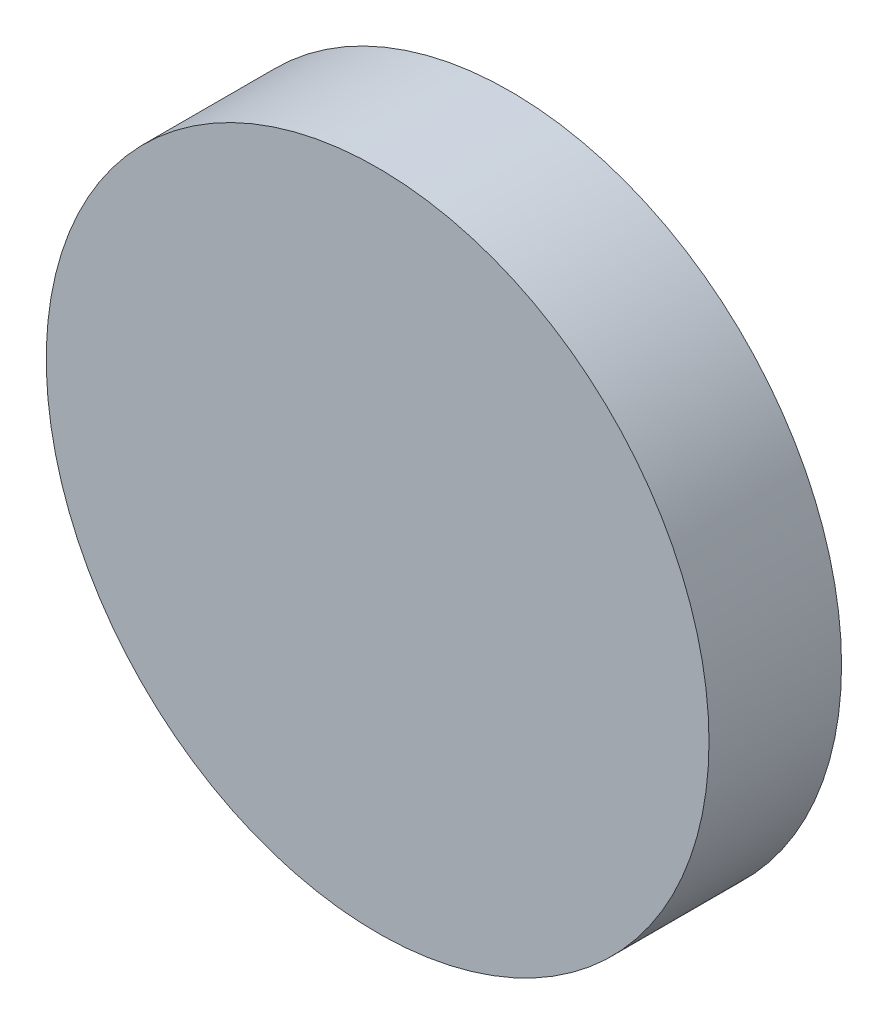
ISO-10303-21;
HEADER;
FILE_DESCRIPTION(('STEP AP214'),'2;1');
FILE_NAME('part.step','',(''),(''),'','','');
FILE_SCHEMA(('AUTOMOTIVE_DESIGN { 1 0 10303 214 1 1 1 1 }'));
ENDSEC;
DATA;
#1=APPLICATION_CONTEXT('core data for automotive mechanical design processes');
#2=APPLICATION_PROTOCOL_DEFINITION('international standard','automotive_design',2000,#1);
#3=PRODUCT_CONTEXT('',#1,'mechanical');
#4=PRODUCT('Part','Part','',(#3));
#5=PRODUCT_RELATED_PRODUCT_CATEGORY('part','',(#4));
#6=PRODUCT_DEFINITION_FORMATION('','',#4);
#7=PRODUCT_DEFINITION_CONTEXT('part definition',#1,'design');
#8=PRODUCT_DEFINITION('design','',#6,#7);
#9=PRODUCT_DEFINITION_SHAPE('','',#8);
#10=(LENGTH_UNIT() NAMED_UNIT(*) SI_UNIT(.MILLI.,.METRE.));
#11=(NAMED_UNIT(*) PLANE_ANGLE_UNIT() SI_UNIT($,.RADIAN.));
#12=(NAMED_UNIT(*) SI_UNIT($,.STERADIAN.) SOLID_ANGLE_UNIT());
#13=UNCERTAINTY_MEASURE_WITH_UNIT(LENGTH_MEASURE(1.E-05),#10,'distance_accuracy_value','');
#14=(GEOMETRIC_REPRESENTATION_CONTEXT(3) GLOBAL_UNCERTAINTY_ASSIGNED_CONTEXT((#13)) GLOBAL_UNIT_ASSIGNED_CONTEXT((#10,
#11,#12)) REPRESENTATION_CONTEXT('',''));
#15=CARTESIAN_POINT('',(0.,0.,0.));
#16=DIRECTION('',(0.,0.,1.));
#17=DIRECTION('',(1.,0.,0.));
#18=AXIS2_PLACEMENT_3D('',#15,#16,#17);
#19=CARTESIAN_POINT('',(0.,0.,5.08));
#20=DIRECTION('',(0.,0.,-1.));
#21=DIRECTION('',(-1.,0.,0.));
#22=AXIS2_PLACEMENT_3D('',#19,#20,#21);
#23=CYLINDRICAL_SURFACE('',#22,12.7);
#24=CARTESIAN_POINT('',(0.,0.,5.08));
#25=DIRECTION('',(0.,0.,1.));
#26=DIRECTION('',(1.,0.,0.));
#27=AXIS2_PLACEMENT_3D('',#24,#25,#26);
#28=CIRCLE('',#27,12.7);
#29=CARTESIAN_POINT('',(12.7,0.,5.08));
#30=VERTEX_POINT('',#29);
#31=EDGE_CURVE('E10',#30,#30,#28,.T.);
#32=ORIENTED_EDGE('',*,*,#31,.F.);
#33=EDGE_LOOP('',(#32));
#34=FACE_BOUND('',#33,.T.);
#35=CARTESIAN_POINT('',(0.,0.,0.));
#36=DIRECTION('',(0.,0.,1.));
#37=DIRECTION('',(1.,0.,0.));
#38=AXIS2_PLACEMENT_3D('',#35,#36,#37);
#39=CIRCLE('',#38,12.7);
#40=CARTESIAN_POINT('',(12.7,0.,0.));
#41=VERTEX_POINT('',#40);
#42=EDGE_CURVE('E40',#41,#41,#39,.T.);
#43=ORIENTED_EDGE('',*,*,#42,.T.);
#44=EDGE_LOOP('',(#43));
#45=FACE_BOUND('',#44,.T.);
#46=ADVANCED_FACE('F37',(#34,#45),#23,.T.);
#47=CARTESIAN_POINT('',(0.,0.,5.08));
#48=DIRECTION('',(0.,0.,1.));
#49=DIRECTION('',(1.,0.,0.));
#50=AXIS2_PLACEMENT_3D('',#47,#48,#49);
#51=PLANE('',#50);
#52=ORIENTED_EDGE('',*,*,#31,.T.);
#53=EDGE_LOOP('',(#52));
#54=FACE_BOUND('',#53,.T.);
#55=ADVANCED_FACE('F52',(#54),#51,.T.);
#56=CARTESIAN_POINT('',(0.,0.,0.));
#57=DIRECTION('',(0.,0.,1.));
#58=DIRECTION('',(1.,0.,0.));
#59=AXIS2_PLACEMENT_3D('',#56,#57,#58);
#60=PLANE('',#59);
#61=ORIENTED_EDGE('',*,*,#42,.F.);
#62=EDGE_LOOP('',(#61));
#63=FACE_BOUND('',#62,.T.);
#64=ADVANCED_FACE('F50',(#63),#60,.F.);
#65=CLOSED_SHELL('',(#46,#55,#64));
#66=MANIFOLD_SOLID_BREP('B2',#65);
#67=ADVANCED_BREP_SHAPE_REPRESENTATION('',(#18,#66),#14);
#68=SHAPE_DEFINITION_REPRESENTATION(#9,#67);
ENDSEC;
END-ISO-10303-21;
